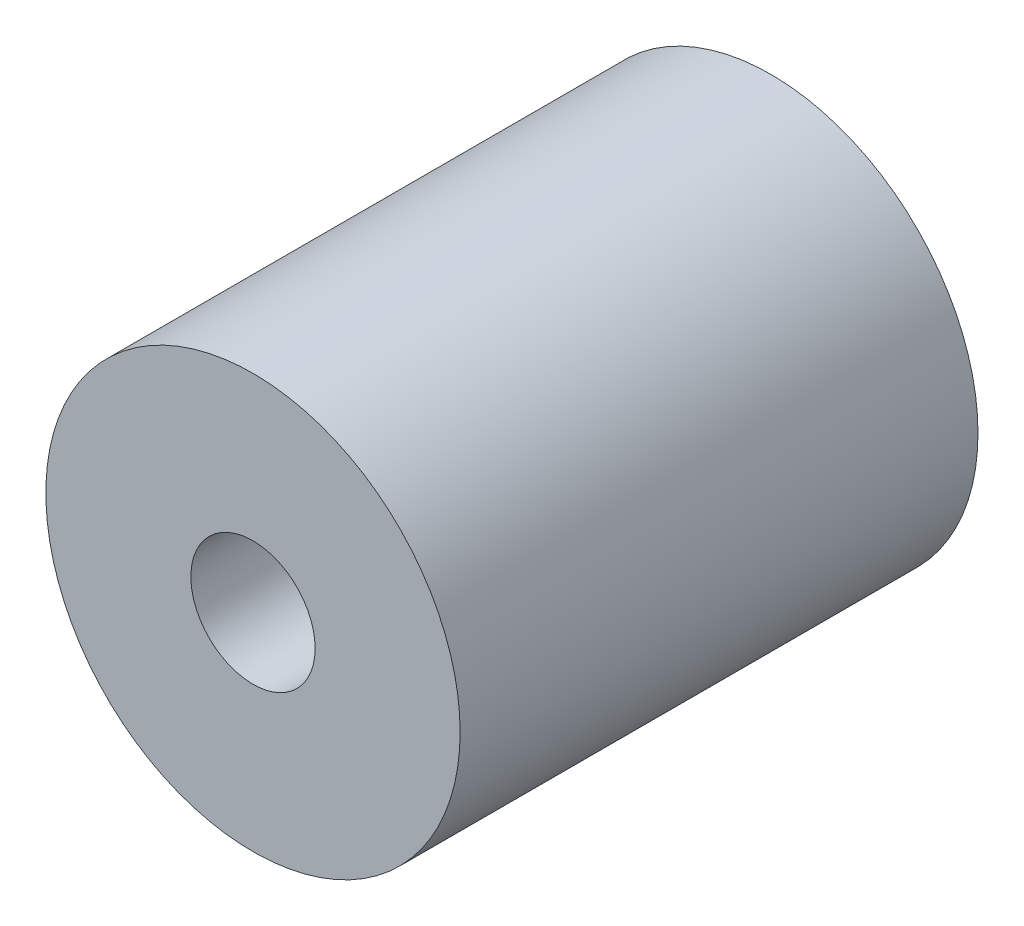
ISO-10303-21;
HEADER;
FILE_DESCRIPTION(('STEP AP214'),'2;1');
FILE_NAME('part.step','',(''),(''),'','','');
FILE_SCHEMA(('AUTOMOTIVE_DESIGN { 1 0 10303 214 1 1 1 1 }'));
ENDSEC;
DATA;
#1=APPLICATION_CONTEXT('core data for automotive mechanical design processes');
#2=APPLICATION_PROTOCOL_DEFINITION('international standard','automotive_design',2000,#1);
#3=PRODUCT_CONTEXT('',#1,'mechanical');
#4=PRODUCT('Part','Part','',(#3));
#5=PRODUCT_RELATED_PRODUCT_CATEGORY('part','',(#4));
#6=PRODUCT_DEFINITION_FORMATION('','',#4);
#7=PRODUCT_DEFINITION_CONTEXT('part definition',#1,'design');
#8=PRODUCT_DEFINITION('design','',#6,#7);
#9=PRODUCT_DEFINITION_SHAPE('','',#8);
#10=(LENGTH_UNIT() NAMED_UNIT(*) SI_UNIT(.MILLI.,.METRE.));
#11=(NAMED_UNIT(*) PLANE_ANGLE_UNIT() SI_UNIT($,.RADIAN.));
#12=(NAMED_UNIT(*) SI_UNIT($,.STERADIAN.) SOLID_ANGLE_UNIT());
#13=UNCERTAINTY_MEASURE_WITH_UNIT(LENGTH_MEASURE(1.E-05),#10,'distance_accuracy_value','');
#14=(GEOMETRIC_REPRESENTATION_CONTEXT(3) GLOBAL_UNCERTAINTY_ASSIGNED_CONTEXT((#13)) GLOBAL_UNIT_ASSIGNED_CONTEXT((#10,
#11,#12)) REPRESENTATION_CONTEXT('',''));
#15=CARTESIAN_POINT('',(0.,0.,0.));
#16=DIRECTION('',(0.,0.,1.));
#17=DIRECTION('',(1.,0.,0.));
#18=AXIS2_PLACEMENT_3D('',#15,#16,#17);
#19=CARTESIAN_POINT('',(0.,0.,-7.5));
#20=DIRECTION('',(0.,0.,1.));
#21=DIRECTION('',(1.,0.,0.));
#22=AXIS2_PLACEMENT_3D('',#19,#20,#21);
#23=PLANE('',#22);
#24=CARTESIAN_POINT('',(0.,0.,-7.5));
#25=DIRECTION('',(0.,0.,1.));
#26=DIRECTION('',(1.,0.,0.));
#27=AXIS2_PLACEMENT_3D('',#24,#25,#26);
#28=CIRCLE('',#27,3.);
#29=CARTESIAN_POINT('',(3.,0.,-7.5));
#30=VERTEX_POINT('',#29);
#31=EDGE_CURVE('E10',#30,#30,#28,.T.);
#32=ORIENTED_EDGE('',*,*,#31,.F.);
#33=EDGE_LOOP('',(#32));
#34=FACE_BOUND('',#33,.T.);
#35=ADVANCED_FACE('F33',(#34),#23,.F.);
#36=CARTESIAN_POINT('',(0.,0.,-12.5));
#37=DIRECTION('',(0.,0.,1.));
#38=DIRECTION('',(1.,0.,0.));
#39=AXIS2_PLACEMENT_3D('',#36,#37,#38);
#40=CYLINDRICAL_SURFACE('',#39,3.);
#41=CARTESIAN_POINT('',(0.,0.,-12.5));
#42=DIRECTION('',(0.,0.,1.));
#43=DIRECTION('',(1.,0.,0.));
#44=AXIS2_PLACEMENT_3D('',#41,#42,#43);
#45=CIRCLE('',#44,3.);
#46=CARTESIAN_POINT('',(3.,0.,-12.5));
#47=VERTEX_POINT('',#46);
#48=EDGE_CURVE('E48',#47,#47,#45,.T.);
#49=ORIENTED_EDGE('',*,*,#48,.F.);
#50=EDGE_LOOP('',(#49));
#51=FACE_BOUND('',#50,.T.);
#52=ORIENTED_EDGE('',*,*,#31,.T.);
#53=EDGE_LOOP('',(#52));
#54=FACE_BOUND('',#53,.T.);
#55=ADVANCED_FACE('F71',(#51,#54),#40,.F.);
#56=CARTESIAN_POINT('',(0.,0.,-12.5));
#57=DIRECTION('',(0.,0.,1.));
#58=DIRECTION('',(1.,0.,0.));
#59=AXIS2_PLACEMENT_3D('',#56,#57,#58);
#60=PLANE('',#59);
#61=ORIENTED_EDGE('',*,*,#48,.T.);
#62=EDGE_LOOP('',(#61));
#63=FACE_BOUND('',#62,.T.);
#64=CARTESIAN_POINT('',(0.,0.,-12.5));
#65=DIRECTION('',(0.,0.,1.));
#66=DIRECTION('',(1.,0.,0.));
#67=AXIS2_PLACEMENT_3D('',#64,#65,#66);
#68=CIRCLE('',#67,10.);
#69=CARTESIAN_POINT('',(10.,0.,-12.5));
#70=VERTEX_POINT('',#69);
#71=EDGE_CURVE('E44',#70,#70,#68,.T.);
#72=ORIENTED_EDGE('',*,*,#71,.F.);
#73=EDGE_LOOP('',(#72));
#74=FACE_BOUND('',#73,.T.);
#75=ADVANCED_FACE('F72',(#63,#74),#60,.F.);
#76=CARTESIAN_POINT('',(0.,0.,-7.5));
#77=DIRECTION('',(0.,0.,1.));
#78=DIRECTION('',(1.,0.,0.));
#79=AXIS2_PLACEMENT_3D('',#76,#77,#78);
#80=CYLINDRICAL_SURFACE('',#79,10.);
#81=CARTESIAN_POINT('',(0.,0.,12.5));
#82=DIRECTION('',(0.,0.,1.));
#83=DIRECTION('',(1.,0.,0.));
#84=AXIS2_PLACEMENT_3D('',#81,#82,#83);
#85=CIRCLE('',#84,10.);
#86=CARTESIAN_POINT('',(10.,0.,12.5));
#87=VERTEX_POINT('',#86);
#88=EDGE_CURVE('E51',#87,#87,#85,.T.);
#89=ORIENTED_EDGE('',*,*,#88,.F.);
#90=EDGE_LOOP('',(#89));
#91=FACE_BOUND('',#90,.T.);
#92=ORIENTED_EDGE('',*,*,#71,.T.);
#93=EDGE_LOOP('',(#92));
#94=FACE_BOUND('',#93,.T.);
#95=ADVANCED_FACE('F35',(#91,#94),#80,.T.);
#96=CARTESIAN_POINT('',(0.,0.,12.5));
#97=DIRECTION('',(0.,0.,1.));
#98=DIRECTION('',(1.,0.,0.));
#99=AXIS2_PLACEMENT_3D('',#96,#97,#98);
#100=PLANE('',#99);
#101=ORIENTED_EDGE('',*,*,#88,.T.);
#102=EDGE_LOOP('',(#101));
#103=FACE_BOUND('',#102,.T.);
#104=CARTESIAN_POINT('',(0.,0.,12.5));
#105=DIRECTION('',(0.,0.,1.));
#106=DIRECTION('',(1.,0.,0.));
#107=AXIS2_PLACEMENT_3D('',#104,#105,#106);
#108=CIRCLE('',#107,3.);
#109=CARTESIAN_POINT('',(3.,0.,12.5));
#110=VERTEX_POINT('',#109);
#111=EDGE_CURVE('E54',#110,#110,#108,.T.);
#112=ORIENTED_EDGE('',*,*,#111,.F.);
#113=EDGE_LOOP('',(#112));
#114=FACE_BOUND('',#113,.T.);
#115=ADVANCED_FACE('F60',(#103,#114),#100,.T.);
#116=CARTESIAN_POINT('',(0.,0.,7.5));
#117=DIRECTION('',(0.,0.,1.));
#118=DIRECTION('',(1.,0.,0.));
#119=AXIS2_PLACEMENT_3D('',#116,#117,#118);
#120=CIRCLE('',#119,3.);
#121=CARTESIAN_POINT('',(3.,0.,7.5));
#122=VERTEX_POINT('',#121);
#123=EDGE_CURVE('E37',#122,#122,#120,.T.);
#124=ORIENTED_EDGE('',*,*,#123,.F.);
#125=EDGE_LOOP('',(#124));
#126=FACE_BOUND('',#125,.T.);
#127=ORIENTED_EDGE('',*,*,#111,.T.);
#128=EDGE_LOOP('',(#127));
#129=FACE_BOUND('',#128,.T.);
#130=ADVANCED_FACE('F58',(#126,#129),#40,.F.);
#131=CARTESIAN_POINT('',(0.,0.,7.5));
#132=DIRECTION('',(0.,0.,1.));
#133=DIRECTION('',(1.,0.,0.));
#134=AXIS2_PLACEMENT_3D('',#131,#132,#133);
#135=PLANE('',#134);
#136=ORIENTED_EDGE('',*,*,#123,.T.);
#137=EDGE_LOOP('',(#136));
#138=FACE_BOUND('',#137,.T.);
#139=ADVANCED_FACE('F68',(#138),#135,.T.);
#140=CLOSED_SHELL('',(#35,#55,#75,#95,#115,#130,#139));
#141=MANIFOLD_SOLID_BREP('B2',#140);
#142=ADVANCED_BREP_SHAPE_REPRESENTATION('',(#18,#141),#14);
#143=SHAPE_DEFINITION_REPRESENTATION(#9,#142);
ENDSEC;
END-ISO-10303-21;
